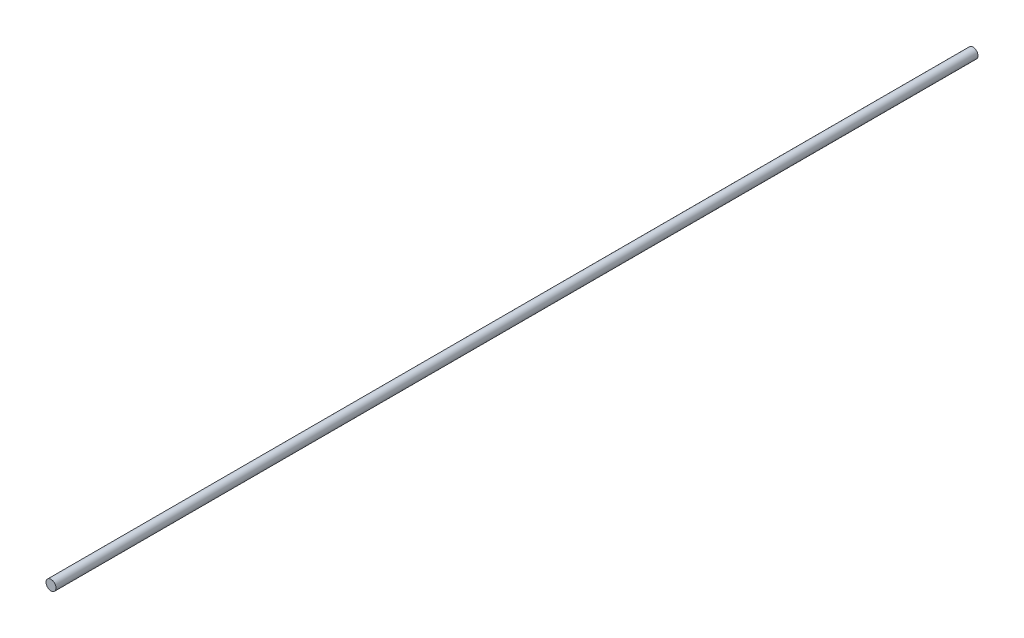
ISO-10303-21;
HEADER;
FILE_DESCRIPTION(('STEP AP214'),'2;1');
FILE_NAME('part.step','',(''),(''),'','','');
FILE_SCHEMA(('AUTOMOTIVE_DESIGN { 1 0 10303 214 1 1 1 1 }'));
ENDSEC;
DATA;
#1=APPLICATION_CONTEXT('core data for automotive mechanical design processes');
#2=APPLICATION_PROTOCOL_DEFINITION('international standard','automotive_design',2000,#1);
#3=PRODUCT_CONTEXT('',#1,'mechanical');
#4=PRODUCT('Part','Part','',(#3));
#5=PRODUCT_RELATED_PRODUCT_CATEGORY('part','',(#4));
#6=PRODUCT_DEFINITION_FORMATION('','',#4);
#7=PRODUCT_DEFINITION_CONTEXT('part definition',#1,'design');
#8=PRODUCT_DEFINITION('design','',#6,#7);
#9=PRODUCT_DEFINITION_SHAPE('','',#8);
#10=(LENGTH_UNIT() NAMED_UNIT(*) SI_UNIT(.MILLI.,.METRE.));
#11=(NAMED_UNIT(*) PLANE_ANGLE_UNIT() SI_UNIT($,.RADIAN.));
#12=(NAMED_UNIT(*) SI_UNIT($,.STERADIAN.) SOLID_ANGLE_UNIT());
#13=UNCERTAINTY_MEASURE_WITH_UNIT(LENGTH_MEASURE(1.E-05),#10,'distance_accuracy_value','');
#14=(GEOMETRIC_REPRESENTATION_CONTEXT(3) GLOBAL_UNCERTAINTY_ASSIGNED_CONTEXT((#13)) GLOBAL_UNIT_ASSIGNED_CONTEXT((#10,
#11,#12)) REPRESENTATION_CONTEXT('',''));
#15=CARTESIAN_POINT('',(0.,0.,0.));
#16=DIRECTION('',(0.,0.,1.));
#17=DIRECTION('',(1.,0.,0.));
#18=AXIS2_PLACEMENT_3D('',#15,#16,#17);
#19=CARTESIAN_POINT('',(0.,0.,2254.25));
#20=DIRECTION('',(0.,0.,-1.));
#21=DIRECTION('',(-1.,0.,0.));
#22=AXIS2_PLACEMENT_3D('',#19,#20,#21);
#23=CYLINDRICAL_SURFACE('',#22,7.9375);
#24=CARTESIAN_POINT('',(0.,0.,539.75));
#25=DIRECTION('',(0.,0.,-1.));
#26=DIRECTION('',(-1.,0.,0.));
#27=AXIS2_PLACEMENT_3D('',#24,#25,#26);
#28=CIRCLE('',#27,7.9375);
#29=CARTESIAN_POINT('',(-7.9375,0.,539.75));
#30=VERTEX_POINT('',#29);
#31=EDGE_CURVE('E10',#30,#30,#28,.T.);
#32=ORIENTED_EDGE('',*,*,#31,.F.);
#33=EDGE_LOOP('',(#32));
#34=FACE_BOUND('',#33,.T.);
#35=CARTESIAN_POINT('',(0.,0.,2000.25));
#36=DIRECTION('',(0.,0.,1.));
#37=DIRECTION('',(1.,0.,0.));
#38=AXIS2_PLACEMENT_3D('',#35,#36,#37);
#39=CIRCLE('',#38,7.9375);
#40=CARTESIAN_POINT('',(7.9375,0.,2000.25));
#41=VERTEX_POINT('',#40);
#42=EDGE_CURVE('E48',#41,#41,#39,.T.);
#43=ORIENTED_EDGE('',*,*,#42,.F.);
#44=EDGE_LOOP('',(#43));
#45=FACE_BOUND('',#44,.T.);
#46=ADVANCED_FACE('F41',(#34,#45),#23,.T.);
#47=CARTESIAN_POINT('',(0.,0.,539.75));
#48=DIRECTION('',(0.,0.,-1.));
#49=DIRECTION('',(-1.,0.,0.));
#50=AXIS2_PLACEMENT_3D('',#47,#48,#49);
#51=PLANE('',#50);
#52=ORIENTED_EDGE('',*,*,#31,.T.);
#53=EDGE_LOOP('',(#52));
#54=FACE_BOUND('',#53,.T.);
#55=ADVANCED_FACE('F58',(#54),#51,.T.);
#56=CARTESIAN_POINT('',(0.,0.,2000.25));
#57=DIRECTION('',(0.,0.,1.));
#58=DIRECTION('',(1.,0.,0.));
#59=AXIS2_PLACEMENT_3D('',#56,#57,#58);
#60=PLANE('',#59);
#61=ORIENTED_EDGE('',*,*,#42,.T.);
#62=EDGE_LOOP('',(#61));
#63=FACE_BOUND('',#62,.T.);
#64=ADVANCED_FACE('F55',(#63),#60,.T.);
#65=CLOSED_SHELL('',(#46,#55,#64));
#66=MANIFOLD_SOLID_BREP('B2',#65);
#67=ADVANCED_BREP_SHAPE_REPRESENTATION('',(#18,#66),#14);
#68=SHAPE_DEFINITION_REPRESENTATION(#9,#67);
ENDSEC;
END-ISO-10303-21;
